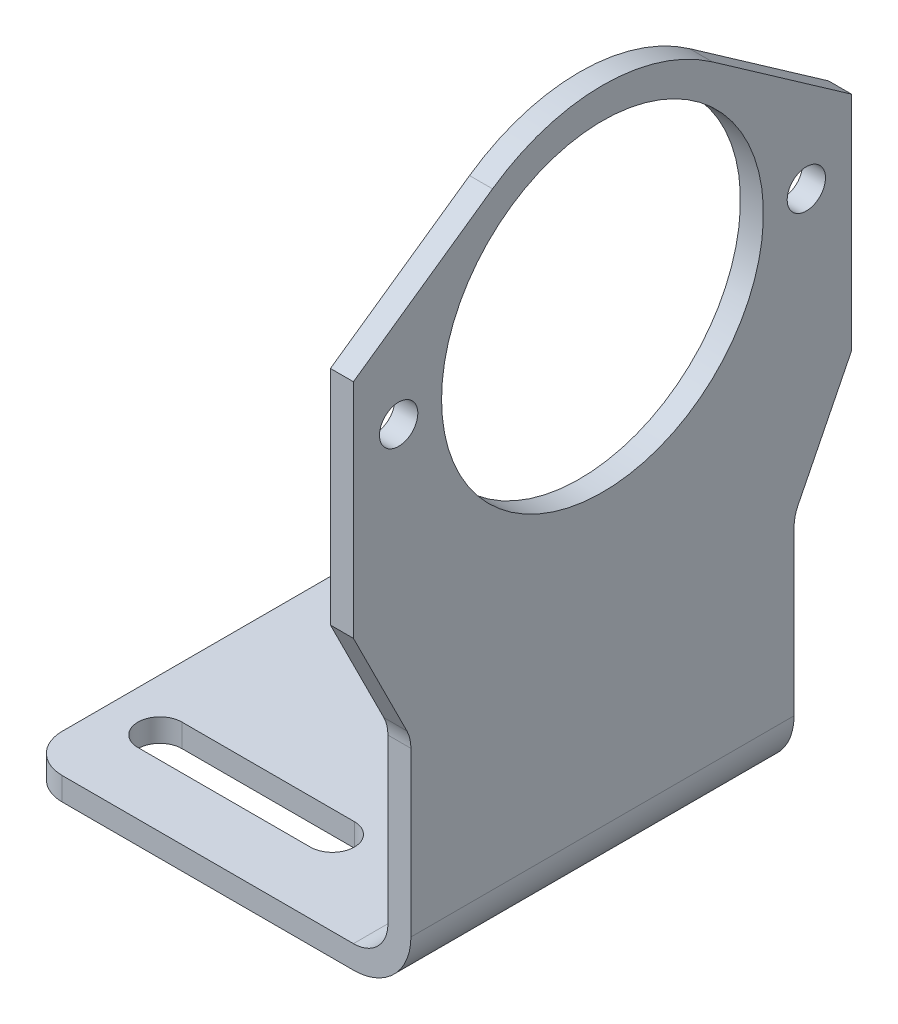
ISO-10303-21;
HEADER;
FILE_DESCRIPTION(('STEP AP214'),'2;1');
FILE_NAME('part.step','',(''),(''),'','','');
FILE_SCHEMA(('AUTOMOTIVE_DESIGN { 1 0 10303 214 1 1 1 1 }'));
ENDSEC;
DATA;
#1=APPLICATION_CONTEXT('core data for automotive mechanical design processes');
#2=APPLICATION_PROTOCOL_DEFINITION('international standard','automotive_design',2000,#1);
#3=PRODUCT_CONTEXT('',#1,'mechanical');
#4=PRODUCT('Part','Part','',(#3));
#5=PRODUCT_RELATED_PRODUCT_CATEGORY('part','',(#4));
#6=PRODUCT_DEFINITION_FORMATION('','',#4);
#7=PRODUCT_DEFINITION_CONTEXT('part definition',#1,'design');
#8=PRODUCT_DEFINITION('design','',#6,#7);
#9=PRODUCT_DEFINITION_SHAPE('','',#8);
#10=(LENGTH_UNIT() NAMED_UNIT(*) SI_UNIT(.MILLI.,.METRE.));
#11=(NAMED_UNIT(*) PLANE_ANGLE_UNIT() SI_UNIT($,.RADIAN.));
#12=(NAMED_UNIT(*) SI_UNIT($,.STERADIAN.) SOLID_ANGLE_UNIT());
#13=UNCERTAINTY_MEASURE_WITH_UNIT(LENGTH_MEASURE(1.E-05),#10,'distance_accuracy_value','');
#14=(GEOMETRIC_REPRESENTATION_CONTEXT(3) GLOBAL_UNCERTAINTY_ASSIGNED_CONTEXT((#13)) GLOBAL_UNIT_ASSIGNED_CONTEXT((#10,
#11,#12)) REPRESENTATION_CONTEXT('',''));
#15=CARTESIAN_POINT('',(0.,0.,0.));
#16=DIRECTION('',(0.,0.,1.));
#17=DIRECTION('',(1.,0.,0.));
#18=AXIS2_PLACEMENT_3D('',#15,#16,#17);
#19=CARTESIAN_POINT('',(-15.,6.,-65.));
#20=DIRECTION('',(0.,0.,-1.));
#21=DIRECTION('',(-1.,0.,0.));
#22=AXIS2_PLACEMENT_3D('',#19,#20,#21);
#23=PLANE('',#22);
#24=DIRECTION('',(0.,1.,0.));
#25=VECTOR('',#24,1.);
#26=CARTESIAN_POINT('',(-6.,0.,-65.));
#27=LINE('',#26,#25);
#28=CARTESIAN_POINT('',(-6.00000000000002,90.,-65.));
#29=VERTEX_POINT('',#28);
#30=CARTESIAN_POINT('',(-6.00000000000001,148.,-65.));
#31=VERTEX_POINT('',#30);
#32=EDGE_CURVE('E429',#29,#31,#27,.T.);
#33=ORIENTED_EDGE('',*,*,#32,.T.);
#34=DIRECTION('',(1.,0.,0.));
#35=VECTOR('',#34,1.);
#36=CARTESIAN_POINT('',(-101.,148.,-65.));
#37=LINE('',#36,#35);
#38=CARTESIAN_POINT('',(0.,148.,-65.));
#39=VERTEX_POINT('',#38);
#40=EDGE_CURVE('E340',#31,#39,#37,.T.);
#41=ORIENTED_EDGE('',*,*,#40,.T.);
#42=DIRECTION('',(0.,1.,0.));
#43=VECTOR('',#42,1.);
#44=CARTESIAN_POINT('',(0.,0.,-65.));
#45=LINE('',#44,#43);
#46=CARTESIAN_POINT('',(0.,89.9999999999999,-65.));
#47=VERTEX_POINT('',#46);
#48=EDGE_CURVE('E420',#47,#39,#45,.T.);
#49=ORIENTED_EDGE('',*,*,#48,.F.);
#50=DIRECTION('',(1.,0.,0.));
#51=VECTOR('',#50,1.);
#52=CARTESIAN_POINT('',(-101.,90.,-65.));
#53=LINE('',#52,#51);
#54=EDGE_CURVE('E345',#29,#47,#53,.T.);
#55=ORIENTED_EDGE('',*,*,#54,.F.);
#56=EDGE_LOOP('',(#33,#41,#49,#55));
#57=FACE_BOUND('',#56,.T.);
#58=ADVANCED_FACE('F60',(#57),#23,.T.);
#59=CARTESIAN_POINT('',(0.,0.,65.));
#60=DIRECTION('',(-1.,0.,0.));
#61=DIRECTION('',(0.,0.,1.));
#62=AXIS2_PLACEMENT_3D('',#59,#60,#61);
#63=PLANE('',#62);
#64=CARTESIAN_POINT('',(0.,132.5,53.2));
#65=DIRECTION('',(-1.,0.,0.));
#66=DIRECTION('',(0.,0.,1.));
#67=AXIS2_PLACEMENT_3D('',#64,#65,#66);
#68=CIRCLE('',#67,5.);
#69=CARTESIAN_POINT('',(0.,132.5,58.2));
#70=VERTEX_POINT('',#69);
#71=EDGE_CURVE('E399',#70,#70,#68,.T.);
#72=ORIENTED_EDGE('',*,*,#71,.T.);
#73=EDGE_LOOP('',(#72));
#74=FACE_BOUND('',#73,.T.);
#75=CARTESIAN_POINT('',(0.,132.5,-53.2));
#76=DIRECTION('',(-1.,0.,0.));
#77=DIRECTION('',(0.,0.,1.));
#78=AXIS2_PLACEMENT_3D('',#75,#76,#77);
#79=CIRCLE('',#78,5.);
#80=CARTESIAN_POINT('',(0.,132.5,-48.2));
#81=VERTEX_POINT('',#80);
#82=EDGE_CURVE('E405',#81,#81,#79,.T.);
#83=ORIENTED_EDGE('',*,*,#82,.T.);
#84=EDGE_LOOP('',(#83));
#85=FACE_BOUND('',#84,.T.);
#86=CARTESIAN_POINT('',(0.,132.5,0.));
#87=DIRECTION('',(-1.,0.,0.));
#88=DIRECTION('',(0.,0.,1.));
#89=AXIS2_PLACEMENT_3D('',#86,#87,#88);
#90=CIRCLE('',#89,42.);
#91=CARTESIAN_POINT('',(0.,132.5,42.));
#92=VERTEX_POINT('',#91);
#93=EDGE_CURVE('E416',#92,#92,#90,.T.);
#94=ORIENTED_EDGE('',*,*,#93,.T.);
#95=EDGE_LOOP('',(#94));
#96=FACE_BOUND('',#95,.T.);
#97=DIRECTION('',(0.,1.,0.));
#98=VECTOR('',#97,1.);
#99=CARTESIAN_POINT('',(0.,0.,50.));
#100=LINE('',#99,#98);
#101=CARTESIAN_POINT('',(0.,15.,50.));
#102=VERTEX_POINT('',#101);
#103=CARTESIAN_POINT('',(0.,57.6393202250021,50.));
#104=VERTEX_POINT('',#103);
#105=EDGE_CURVE('E380',#102,#104,#100,.T.);
#106=ORIENTED_EDGE('',*,*,#105,.F.);
#107=DIRECTION('',(0.,0.,-1.));
#108=VECTOR('',#107,1.);
#109=CARTESIAN_POINT('',(0.,15.,65.));
#110=LINE('',#109,#108);
#111=CARTESIAN_POINT('',(0.,15.,-50.));
#112=VERTEX_POINT('',#111);
#113=EDGE_CURVE('E433',#102,#112,#110,.T.);
#114=ORIENTED_EDGE('',*,*,#113,.T.);
#115=DIRECTION('',(0.,-1.,0.));
#116=VECTOR('',#115,1.);
#117=CARTESIAN_POINT('',(0.,0.,-50.));
#118=LINE('',#117,#116);
#119=CARTESIAN_POINT('',(0.,57.6393202250021,-50.));
#120=VERTEX_POINT('',#119);
#121=EDGE_CURVE('E367',#120,#112,#118,.T.);
#122=ORIENTED_EDGE('',*,*,#121,.F.);
#123=CARTESIAN_POINT('',(0.,57.6393202250021,-60.));
#124=DIRECTION('',(-1.,0.,0.));
#125=DIRECTION('',(0.,0.,1.));
#126=AXIS2_PLACEMENT_3D('',#123,#124,#125);
#127=CIRCLE('',#126,10.);
#128=CARTESIAN_POINT('',(0.,62.1114561800017,-51.0557280900008));
#129=VERTEX_POINT('',#128);
#130=EDGE_CURVE('E69',#120,#129,#127,.T.);
#131=ORIENTED_EDGE('',*,*,#130,.T.);
#132=DIRECTION('',(0.,-0.894427190999916,0.447213595499958));
#133=VECTOR('',#132,1.);
#134=CARTESIAN_POINT('',(0.,90.0000000000002,-65.0000000000001));
#135=LINE('',#134,#133);
#136=EDGE_CURVE('E395',#129,#47,#135,.F.);
#137=ORIENTED_EDGE('',*,*,#136,.T.);
#138=ORIENTED_EDGE('',*,*,#48,.T.);
#139=DIRECTION('',(0.,-0.573958305896006,-0.818884523661906));
#140=VECTOR('',#139,1.);
#141=CARTESIAN_POINT('',(0.,160.34536034807,-47.3864827388777));
#142=LINE('',#141,#140);
#143=CARTESIAN_POINT('',(0.,173.444226183095,-28.6979152948003));
#144=VERTEX_POINT('',#143);
#145=EDGE_CURVE('E396',#144,#39,#142,.T.);
#146=ORIENTED_EDGE('',*,*,#145,.F.);
#147=CARTESIAN_POINT('',(0.,132.5,0.));
#148=DIRECTION('',(1.,0.,0.));
#149=DIRECTION('',(0.,0.,-1.));
#150=AXIS2_PLACEMENT_3D('',#147,#148,#149);
#151=CIRCLE('',#150,50.);
#152=CARTESIAN_POINT('',(0.,173.444226183095,28.6979152948004));
#153=VERTEX_POINT('',#152);
#154=EDGE_CURVE('E489',#153,#144,#151,.F.);
#155=ORIENTED_EDGE('',*,*,#154,.F.);
#156=DIRECTION('',(0.,0.573958305896007,-0.818884523661905));
#157=VECTOR('',#156,1.);
#158=CARTESIAN_POINT('',(0.,99.2446357377619,134.560824940966));
#159=LINE('',#158,#157);
#160=CARTESIAN_POINT('',(0.,148.,65.));
#161=VERTEX_POINT('',#160);
#162=EDGE_CURVE('E360',#161,#153,#159,.T.);
#163=ORIENTED_EDGE('',*,*,#162,.F.);
#164=DIRECTION('',(0.,1.,0.));
#165=VECTOR('',#164,1.);
#166=CARTESIAN_POINT('',(0.,0.,65.));
#167=LINE('',#166,#165);
#168=CARTESIAN_POINT('',(0.,90.,65.));
#169=VERTEX_POINT('',#168);
#170=EDGE_CURVE('E424',#169,#161,#167,.T.);
#171=ORIENTED_EDGE('',*,*,#170,.F.);
#172=DIRECTION('',(0.,0.894427190999916,0.447213595499958));
#173=VECTOR('',#172,1.);
#174=CARTESIAN_POINT('',(0.,60.,50.));
#175=LINE('',#174,#173);
#176=CARTESIAN_POINT('',(0.,62.1114561800017,51.0557280900008));
#177=VERTEX_POINT('',#176);
#178=EDGE_CURVE('E366',#169,#177,#175,.F.);
#179=ORIENTED_EDGE('',*,*,#178,.T.);
#180=CARTESIAN_POINT('',(0.,57.6393202250021,60.));
#181=DIRECTION('',(-1.,0.,0.));
#182=DIRECTION('',(0.,0.,1.));
#183=AXIS2_PLACEMENT_3D('',#180,#181,#182);
#184=CIRCLE('',#183,10.);
#185=EDGE_CURVE('E535',#177,#104,#184,.T.);
#186=ORIENTED_EDGE('',*,*,#185,.T.);
#187=EDGE_LOOP('',(#106,#114,#122,#131,#137,#138,#146,#155,#163,#171,#179,#186));
#188=FACE_BOUND('',#187,.T.);
#189=ADVANCED_FACE('F546',(#74,#85,#96,#188),#63,.F.);
#190=CARTESIAN_POINT('',(-6.,0.,65.));
#191=DIRECTION('',(-1.,0.,0.));
#192=DIRECTION('',(0.,0.,1.));
#193=AXIS2_PLACEMENT_3D('',#190,#191,#192);
#194=PLANE('',#193);
#195=CARTESIAN_POINT('',(-6.,132.5,53.2));
#196=DIRECTION('',(-1.,0.,0.));
#197=DIRECTION('',(0.,0.,1.));
#198=AXIS2_PLACEMENT_3D('',#195,#196,#197);
#199=CIRCLE('',#198,5.);
#200=CARTESIAN_POINT('',(-6.,132.5,58.2));
#201=VERTEX_POINT('',#200);
#202=EDGE_CURVE('E409',#201,#201,#199,.T.);
#203=ORIENTED_EDGE('',*,*,#202,.F.);
#204=EDGE_LOOP('',(#203));
#205=FACE_BOUND('',#204,.T.);
#206=CARTESIAN_POINT('',(-6.,132.5,-53.2));
#207=DIRECTION('',(-1.,0.,0.));
#208=DIRECTION('',(0.,0.,1.));
#209=AXIS2_PLACEMENT_3D('',#206,#207,#208);
#210=CIRCLE('',#209,5.);
#211=CARTESIAN_POINT('',(-6.,132.5,-48.2));
#212=VERTEX_POINT('',#211);
#213=EDGE_CURVE('E400',#212,#212,#210,.T.);
#214=ORIENTED_EDGE('',*,*,#213,.F.);
#215=EDGE_LOOP('',(#214));
#216=FACE_BOUND('',#215,.T.);
#217=CARTESIAN_POINT('',(-6.,132.5,0.));
#218=DIRECTION('',(-1.,0.,0.));
#219=DIRECTION('',(0.,0.,1.));
#220=AXIS2_PLACEMENT_3D('',#217,#218,#219);
#221=CIRCLE('',#220,42.);
#222=CARTESIAN_POINT('',(-6.,132.5,42.));
#223=VERTEX_POINT('',#222);
#224=EDGE_CURVE('E404',#223,#223,#221,.T.);
#225=ORIENTED_EDGE('',*,*,#224,.F.);
#226=EDGE_LOOP('',(#225));
#227=FACE_BOUND('',#226,.T.);
#228=DIRECTION('',(0.,0.,-1.));
#229=VECTOR('',#228,1.);
#230=CARTESIAN_POINT('',(-6.,15.,65.));
#231=LINE('',#230,#229);
#232=CARTESIAN_POINT('',(-6.,15.,50.));
#233=VERTEX_POINT('',#232);
#234=CARTESIAN_POINT('',(-6.,15.,-50.));
#235=VERTEX_POINT('',#234);
#236=EDGE_CURVE('E458',#233,#235,#231,.T.);
#237=ORIENTED_EDGE('',*,*,#236,.F.);
#238=DIRECTION('',(0.,1.,0.));
#239=VECTOR('',#238,1.);
#240=CARTESIAN_POINT('',(-6.,0.,50.));
#241=LINE('',#240,#239);
#242=CARTESIAN_POINT('',(-6.,57.6393202250021,50.));
#243=VERTEX_POINT('',#242);
#244=EDGE_CURVE('E391',#233,#243,#241,.T.);
#245=ORIENTED_EDGE('',*,*,#244,.T.);
#246=CARTESIAN_POINT('',(-6.00000000000001,57.6393202250021,60.));
#247=DIRECTION('',(-1.,0.,0.));
#248=DIRECTION('',(0.,0.,1.));
#249=AXIS2_PLACEMENT_3D('',#246,#247,#248);
#250=CIRCLE('',#249,10.);
#251=CARTESIAN_POINT('',(-6.,62.1114561800017,51.0557280900008));
#252=VERTEX_POINT('',#251);
#253=EDGE_CURVE('E538',#243,#252,#250,.F.);
#254=ORIENTED_EDGE('',*,*,#253,.T.);
#255=DIRECTION('',(0.,0.894427190999916,0.447213595499958));
#256=VECTOR('',#255,1.);
#257=CARTESIAN_POINT('',(-6.,18.,29.));
#258=LINE('',#257,#256);
#259=CARTESIAN_POINT('',(-6.00000000000001,90.,65.));
#260=VERTEX_POINT('',#259);
#261=EDGE_CURVE('E363',#252,#260,#258,.T.);
#262=ORIENTED_EDGE('',*,*,#261,.T.);
#263=DIRECTION('',(0.,1.,0.));
#264=VECTOR('',#263,1.);
#265=CARTESIAN_POINT('',(-6.,0.,65.));
#266=LINE('',#265,#264);
#267=CARTESIAN_POINT('',(-6.,148.,65.));
#268=VERTEX_POINT('',#267);
#269=EDGE_CURVE('E428',#260,#268,#266,.T.);
#270=ORIENTED_EDGE('',*,*,#269,.T.);
#271=DIRECTION('',(0.,0.573958305896007,-0.818884523661905));
#272=VECTOR('',#271,1.);
#273=CARTESIAN_POINT('',(-6.,99.2446357377619,134.560824940966));
#274=LINE('',#273,#272);
#275=CARTESIAN_POINT('',(-6.00000000000001,173.444226183095,28.6979152948004));
#276=VERTEX_POINT('',#275);
#277=EDGE_CURVE('E338',#268,#276,#274,.T.);
#278=ORIENTED_EDGE('',*,*,#277,.T.);
#279=CARTESIAN_POINT('',(-6.00000000000001,132.5,0.));
#280=DIRECTION('',(-1.,0.,0.));
#281=DIRECTION('',(0.,0.,1.));
#282=AXIS2_PLACEMENT_3D('',#279,#280,#281);
#283=CIRCLE('',#282,50.);
#284=CARTESIAN_POINT('',(-6.,173.444226183095,-28.6979152948003));
#285=VERTEX_POINT('',#284);
#286=EDGE_CURVE('E485',#276,#285,#283,.T.);
#287=ORIENTED_EDGE('',*,*,#286,.T.);
#288=DIRECTION('',(0.,-0.573958305896006,-0.818884523661906));
#289=VECTOR('',#288,1.);
#290=CARTESIAN_POINT('',(-6.,160.34536034807,-47.3864827388777));
#291=LINE('',#290,#289);
#292=EDGE_CURVE('E481',#285,#31,#291,.T.);
#293=ORIENTED_EDGE('',*,*,#292,.T.);
#294=ORIENTED_EDGE('',*,*,#32,.F.);
#295=DIRECTION('',(0.,-0.894427190999916,0.447213595499958));
#296=VECTOR('',#295,1.);
#297=CARTESIAN_POINT('',(-6.,-34.,-3.));
#298=LINE('',#297,#296);
#299=CARTESIAN_POINT('',(-6.,62.1114561800017,-51.0557280900009));
#300=VERTEX_POINT('',#299);
#301=EDGE_CURVE('E477',#29,#300,#298,.T.);
#302=ORIENTED_EDGE('',*,*,#301,.T.);
#303=CARTESIAN_POINT('',(-6.00000000000001,57.6393202250021,-60.));
#304=DIRECTION('',(-1.,0.,0.));
#305=DIRECTION('',(0.,0.,1.));
#306=AXIS2_PLACEMENT_3D('',#303,#304,#305);
#307=CIRCLE('',#306,10.);
#308=CARTESIAN_POINT('',(-6.,57.6393202250021,-50.));
#309=VERTEX_POINT('',#308);
#310=EDGE_CURVE('E14',#300,#309,#307,.F.);
#311=ORIENTED_EDGE('',*,*,#310,.T.);
#312=DIRECTION('',(0.,-1.,0.));
#313=VECTOR('',#312,1.);
#314=CARTESIAN_POINT('',(-6.,0.,-50.));
#315=LINE('',#314,#313);
#316=EDGE_CURVE('E377',#309,#235,#315,.T.);
#317=ORIENTED_EDGE('',*,*,#316,.T.);
#318=EDGE_LOOP('',(#237,#245,#254,#262,#270,#278,#287,#293,#294,#302,#311,#317));
#319=FACE_BOUND('',#318,.T.);
#320=ADVANCED_FACE('F559',(#205,#216,#227,#319),#194,.T.);
#321=CARTESIAN_POINT('',(-15.,15.,65.));
#322=DIRECTION('',(0.,0.,-1.));
#323=DIRECTION('',(-1.,0.,0.));
#324=AXIS2_PLACEMENT_3D('',#321,#322,#323);
#325=CYLINDRICAL_SURFACE('',#324,9.);
#326=DIRECTION('',(0.,0.,-1.));
#327=VECTOR('',#326,1.);
#328=CARTESIAN_POINT('',(-15.,6.,65.));
#329=LINE('',#328,#327);
#330=CARTESIAN_POINT('',(-15.,6.,50.));
#331=VERTEX_POINT('',#330);
#332=CARTESIAN_POINT('',(-15.,6.,-50.));
#333=VERTEX_POINT('',#332);
#334=EDGE_CURVE('E454',#331,#333,#329,.T.);
#335=ORIENTED_EDGE('',*,*,#334,.F.);
#336=CARTESIAN_POINT('',(-15.,15.,50.));
#337=DIRECTION('',(0.,0.,1.));
#338=DIRECTION('',(1.,0.,0.));
#339=AXIS2_PLACEMENT_3D('',#336,#337,#338);
#340=CIRCLE('',#339,9.);
#341=EDGE_CURVE('E387',#331,#233,#340,.T.);
#342=ORIENTED_EDGE('',*,*,#341,.T.);
#343=ORIENTED_EDGE('',*,*,#236,.T.);
#344=CARTESIAN_POINT('',(-15.,15.,-50.));
#345=DIRECTION('',(0.,0.,-1.));
#346=DIRECTION('',(-1.,0.,0.));
#347=AXIS2_PLACEMENT_3D('',#344,#345,#346);
#348=CIRCLE('',#347,9.);
#349=EDGE_CURVE('E373',#235,#333,#348,.T.);
#350=ORIENTED_EDGE('',*,*,#349,.T.);
#351=EDGE_LOOP('',(#335,#342,#343,#350));
#352=FACE_BOUND('',#351,.T.);
#353=ADVANCED_FACE('F566',(#352),#325,.F.);
#354=CARTESIAN_POINT('',(-101.,6.,65.));
#355=DIRECTION('',(0.,1.,0.));
#356=DIRECTION('',(0.,0.,1.));
#357=AXIS2_PLACEMENT_3D('',#354,#355,#356);
#358=PLANE('',#357);
#359=CARTESIAN_POINT('',(-42.45,6.,-27.95));
#360=DIRECTION('',(0.,1.,0.));
#361=DIRECTION('',(0.,0.,1.));
#362=AXIS2_PLACEMENT_3D('',#359,#360,#361);
#363=CIRCLE('',#362,5.75000000000001);
#364=CARTESIAN_POINT('',(-42.45,6.,-22.2));
#365=VERTEX_POINT('',#364);
#366=CARTESIAN_POINT('',(-42.45,6.,-33.7));
#367=VERTEX_POINT('',#366);
#368=EDGE_CURVE('E241',#365,#367,#363,.T.);
#369=ORIENTED_EDGE('',*,*,#368,.F.);
#370=DIRECTION('',(1.,0.,0.));
#371=VECTOR('',#370,1.);
#372=CARTESIAN_POINT('',(-42.45,6.,-22.2));
#373=LINE('',#372,#371);
#374=CARTESIAN_POINT('',(-87.45,6.,-22.2));
#375=VERTEX_POINT('',#374);
#376=EDGE_CURVE('E262',#375,#365,#373,.T.);
#377=ORIENTED_EDGE('',*,*,#376,.F.);
#378=CARTESIAN_POINT('',(-87.45,6.,-27.95));
#379=DIRECTION('',(0.,1.,0.));
#380=DIRECTION('',(0.,0.,1.));
#381=AXIS2_PLACEMENT_3D('',#378,#379,#380);
#382=CIRCLE('',#381,5.75);
#383=CARTESIAN_POINT('',(-87.45,6.,-33.7));
#384=VERTEX_POINT('',#383);
#385=EDGE_CURVE('E268',#384,#375,#382,.T.);
#386=ORIENTED_EDGE('',*,*,#385,.F.);
#387=DIRECTION('',(-1.,0.,0.));
#388=VECTOR('',#387,1.);
#389=CARTESIAN_POINT('',(-42.45,6.,-33.7));
#390=LINE('',#389,#388);
#391=EDGE_CURVE('E277',#367,#384,#390,.T.);
#392=ORIENTED_EDGE('',*,*,#391,.F.);
#393=EDGE_LOOP('',(#369,#377,#386,#392));
#394=FACE_BOUND('',#393,.T.);
#395=CARTESIAN_POINT('',(-42.45,6.,28.05));
#396=DIRECTION('',(0.,1.,0.));
#397=DIRECTION('',(0.,0.,1.));
#398=AXIS2_PLACEMENT_3D('',#395,#396,#397);
#399=CIRCLE('',#398,5.75);
#400=CARTESIAN_POINT('',(-42.45,6.,33.8));
#401=VERTEX_POINT('',#400);
#402=CARTESIAN_POINT('',(-42.45,6.,22.3));
#403=VERTEX_POINT('',#402);
#404=EDGE_CURVE('E278',#401,#403,#399,.T.);
#405=ORIENTED_EDGE('',*,*,#404,.F.);
#406=DIRECTION('',(1.,0.,0.));
#407=VECTOR('',#406,1.);
#408=CARTESIAN_POINT('',(-42.45,6.,33.8));
#409=LINE('',#408,#407);
#410=CARTESIAN_POINT('',(-87.45,6.,33.8));
#411=VERTEX_POINT('',#410);
#412=EDGE_CURVE('E306',#411,#401,#409,.T.);
#413=ORIENTED_EDGE('',*,*,#412,.F.);
#414=CARTESIAN_POINT('',(-87.45,6.,28.05));
#415=DIRECTION('',(0.,1.,0.));
#416=DIRECTION('',(0.,0.,1.));
#417=AXIS2_PLACEMENT_3D('',#414,#415,#416);
#418=CIRCLE('',#417,5.75);
#419=CARTESIAN_POINT('',(-87.45,6.,22.3));
#420=VERTEX_POINT('',#419);
#421=EDGE_CURVE('E310',#420,#411,#418,.T.);
#422=ORIENTED_EDGE('',*,*,#421,.F.);
#423=DIRECTION('',(-1.,0.,0.));
#424=VECTOR('',#423,1.);
#425=CARTESIAN_POINT('',(-42.45,6.,22.3));
#426=LINE('',#425,#424);
#427=EDGE_CURVE('E315',#403,#420,#426,.T.);
#428=ORIENTED_EDGE('',*,*,#427,.F.);
#429=EDGE_LOOP('',(#405,#413,#422,#428));
#430=FACE_BOUND('',#429,.T.);
#431=DIRECTION('',(0.,0.,-1.));
#432=VECTOR('',#431,1.);
#433=CARTESIAN_POINT('',(-101.,6.,65.));
#434=LINE('',#433,#432);
#435=CARTESIAN_POINT('',(-101.,6.,40.));
#436=VERTEX_POINT('',#435);
#437=CARTESIAN_POINT('',(-101.,6.,-40.));
#438=VERTEX_POINT('',#437);
#439=EDGE_CURVE('E451',#436,#438,#434,.T.);
#440=ORIENTED_EDGE('',*,*,#439,.F.);
#441=CARTESIAN_POINT('',(-91.,6.,40.));
#442=DIRECTION('',(0.,1.,0.));
#443=DIRECTION('',(0.,0.,1.));
#444=AXIS2_PLACEMENT_3D('',#441,#442,#443);
#445=CIRCLE('',#444,10.);
#446=CARTESIAN_POINT('',(-91.,6.,50.));
#447=VERTEX_POINT('',#446);
#448=EDGE_CURVE('E532',#436,#447,#445,.T.);
#449=ORIENTED_EDGE('',*,*,#448,.T.);
#450=DIRECTION('',(1.,0.,0.));
#451=VECTOR('',#450,1.);
#452=CARTESIAN_POINT('',(-101.,6.,50.));
#453=LINE('',#452,#451);
#454=EDGE_CURVE('E384',#447,#331,#453,.T.);
#455=ORIENTED_EDGE('',*,*,#454,.T.);
#456=ORIENTED_EDGE('',*,*,#334,.T.);
#457=DIRECTION('',(-1.,0.,0.));
#458=VECTOR('',#457,1.);
#459=CARTESIAN_POINT('',(-101.,6.,-50.));
#460=LINE('',#459,#458);
#461=CARTESIAN_POINT('',(-91.,6.,-50.));
#462=VERTEX_POINT('',#461);
#463=EDGE_CURVE('E370',#333,#462,#460,.T.);
#464=ORIENTED_EDGE('',*,*,#463,.T.);
#465=CARTESIAN_POINT('',(-91.,6.,-40.));
#466=DIRECTION('',(0.,1.,0.));
#467=DIRECTION('',(0.,0.,1.));
#468=AXIS2_PLACEMENT_3D('',#465,#466,#467);
#469=CIRCLE('',#468,10.);
#470=EDGE_CURVE('E76',#462,#438,#469,.T.);
#471=ORIENTED_EDGE('',*,*,#470,.T.);
#472=EDGE_LOOP('',(#440,#449,#455,#456,#464,#471));
#473=FACE_BOUND('',#472,.T.);
#474=ADVANCED_FACE('F618',(#394,#430,#473),#358,.T.);
#475=CARTESIAN_POINT('',(-101.,0.,65.));
#476=DIRECTION('',(-1.,0.,0.));
#477=DIRECTION('',(0.,0.,1.));
#478=AXIS2_PLACEMENT_3D('',#475,#476,#477);
#479=PLANE('',#478);
#480=DIRECTION('',(0.,0.,-1.));
#481=VECTOR('',#480,1.);
#482=CARTESIAN_POINT('',(-101.,0.,65.));
#483=LINE('',#482,#481);
#484=CARTESIAN_POINT('',(-101.,0.,40.));
#485=VERTEX_POINT('',#484);
#486=CARTESIAN_POINT('',(-101.,0.,-40.));
#487=VERTEX_POINT('',#486);
#488=EDGE_CURVE('E447',#485,#487,#483,.T.);
#489=ORIENTED_EDGE('',*,*,#488,.F.);
#490=DIRECTION('',(0.,-1.,0.));
#491=VECTOR('',#490,1.);
#492=CARTESIAN_POINT('',(-101.,0.,40.));
#493=LINE('',#492,#491);
#494=EDGE_CURVE('E83',#485,#436,#493,.F.);
#495=ORIENTED_EDGE('',*,*,#494,.T.);
#496=ORIENTED_EDGE('',*,*,#439,.T.);
#497=DIRECTION('',(0.,1.,0.));
#498=VECTOR('',#497,1.);
#499=CARTESIAN_POINT('',(-101.,0.,-40.));
#500=LINE('',#499,#498);
#501=EDGE_CURVE('E525',#438,#487,#500,.F.);
#502=ORIENTED_EDGE('',*,*,#501,.T.);
#503=EDGE_LOOP('',(#489,#495,#496,#502));
#504=FACE_BOUND('',#503,.T.);
#505=ADVANCED_FACE('F632',(#504),#479,.T.);
#506=CARTESIAN_POINT('',(-101.,0.,65.));
#507=DIRECTION('',(0.,1.,0.));
#508=DIRECTION('',(0.,0.,1.));
#509=AXIS2_PLACEMENT_3D('',#506,#507,#508);
#510=PLANE('',#509);
#511=DIRECTION('',(1.,0.,0.));
#512=VECTOR('',#511,1.);
#513=CARTESIAN_POINT('',(-42.45,0.,-22.2));
#514=LINE('',#513,#512);
#515=CARTESIAN_POINT('',(-87.45,0.,-22.2));
#516=VERTEX_POINT('',#515);
#517=CARTESIAN_POINT('',(-42.45,0.,-22.2));
#518=VERTEX_POINT('',#517);
#519=EDGE_CURVE('E247',#516,#518,#514,.T.);
#520=ORIENTED_EDGE('',*,*,#519,.T.);
#521=CARTESIAN_POINT('',(-42.45,0.,-27.95));
#522=DIRECTION('',(0.,1.,0.));
#523=DIRECTION('',(0.,0.,1.));
#524=AXIS2_PLACEMENT_3D('',#521,#522,#523);
#525=CIRCLE('',#524,5.75000000000001);
#526=CARTESIAN_POINT('',(-42.45,0.,-33.7));
#527=VERTEX_POINT('',#526);
#528=EDGE_CURVE('E238',#518,#527,#525,.T.);
#529=ORIENTED_EDGE('',*,*,#528,.T.);
#530=DIRECTION('',(-1.,0.,0.));
#531=VECTOR('',#530,1.);
#532=CARTESIAN_POINT('',(-42.45,0.,-33.7));
#533=LINE('',#532,#531);
#534=CARTESIAN_POINT('',(-87.45,0.,-33.7));
#535=VERTEX_POINT('',#534);
#536=EDGE_CURVE('E251',#527,#535,#533,.T.);
#537=ORIENTED_EDGE('',*,*,#536,.T.);
#538=CARTESIAN_POINT('',(-87.45,0.,-27.95));
#539=DIRECTION('',(0.,1.,0.));
#540=DIRECTION('',(0.,0.,1.));
#541=AXIS2_PLACEMENT_3D('',#538,#539,#540);
#542=CIRCLE('',#541,5.75);
#543=EDGE_CURVE('E256',#535,#516,#542,.T.);
#544=ORIENTED_EDGE('',*,*,#543,.T.);
#545=EDGE_LOOP('',(#520,#529,#537,#544));
#546=FACE_BOUND('',#545,.T.);
#547=DIRECTION('',(1.,0.,0.));
#548=VECTOR('',#547,1.);
#549=CARTESIAN_POINT('',(-42.45,0.,33.8));
#550=LINE('',#549,#548);
#551=CARTESIAN_POINT('',(-87.45,0.,33.8));
#552=VERTEX_POINT('',#551);
#553=CARTESIAN_POINT('',(-42.45,0.,33.8));
#554=VERTEX_POINT('',#553);
#555=EDGE_CURVE('E296',#552,#554,#550,.T.);
#556=ORIENTED_EDGE('',*,*,#555,.T.);
#557=CARTESIAN_POINT('',(-42.45,0.,28.05));
#558=DIRECTION('',(0.,1.,0.));
#559=DIRECTION('',(0.,0.,1.));
#560=AXIS2_PLACEMENT_3D('',#557,#558,#559);
#561=CIRCLE('',#560,5.75);
#562=CARTESIAN_POINT('',(-42.45,0.,22.3));
#563=VERTEX_POINT('',#562);
#564=EDGE_CURVE('E311',#554,#563,#561,.T.);
#565=ORIENTED_EDGE('',*,*,#564,.T.);
#566=DIRECTION('',(-1.,0.,0.));
#567=VECTOR('',#566,1.);
#568=CARTESIAN_POINT('',(-42.45,0.,22.3));
#569=LINE('',#568,#567);
#570=CARTESIAN_POINT('',(-87.45,0.,22.3));
#571=VERTEX_POINT('',#570);
#572=EDGE_CURVE('E328',#563,#571,#569,.T.);
#573=ORIENTED_EDGE('',*,*,#572,.T.);
#574=CARTESIAN_POINT('',(-87.45,0.,28.05));
#575=DIRECTION('',(0.,1.,0.));
#576=DIRECTION('',(0.,0.,1.));
#577=AXIS2_PLACEMENT_3D('',#574,#575,#576);
#578=CIRCLE('',#577,5.75);
#579=EDGE_CURVE('E324',#571,#552,#578,.T.);
#580=ORIENTED_EDGE('',*,*,#579,.T.);
#581=EDGE_LOOP('',(#556,#565,#573,#580));
#582=FACE_BOUND('',#581,.T.);
#583=DIRECTION('',(1.,0.,0.));
#584=VECTOR('',#583,1.);
#585=CARTESIAN_POINT('',(-101.,0.,50.));
#586=LINE('',#585,#584);
#587=CARTESIAN_POINT('',(-91.,0.,50.));
#588=VERTEX_POINT('',#587);
#589=CARTESIAN_POINT('',(-15.,0.,50.));
#590=VERTEX_POINT('',#589);
#591=EDGE_CURVE('E335',#588,#590,#586,.T.);
#592=ORIENTED_EDGE('',*,*,#591,.F.);
#593=CARTESIAN_POINT('',(-91.,0.,40.));
#594=DIRECTION('',(0.,1.,0.));
#595=DIRECTION('',(0.,0.,1.));
#596=AXIS2_PLACEMENT_3D('',#593,#594,#595);
#597=CIRCLE('',#596,10.);
#598=EDGE_CURVE('E522',#588,#485,#597,.F.);
#599=ORIENTED_EDGE('',*,*,#598,.T.);
#600=ORIENTED_EDGE('',*,*,#488,.T.);
#601=CARTESIAN_POINT('',(-91.,0.,-40.));
#602=DIRECTION('',(0.,1.,0.));
#603=DIRECTION('',(0.,0.,1.));
#604=AXIS2_PLACEMENT_3D('',#601,#602,#603);
#605=CIRCLE('',#604,10.);
#606=CARTESIAN_POINT('',(-91.,0.,-50.));
#607=VERTEX_POINT('',#606);
#608=EDGE_CURVE('E519',#487,#607,#605,.F.);
#609=ORIENTED_EDGE('',*,*,#608,.T.);
#610=DIRECTION('',(1.,0.,0.));
#611=VECTOR('',#610,1.);
#612=CARTESIAN_POINT('',(-101.,0.,-50.));
#613=LINE('',#612,#611);
#614=CARTESIAN_POINT('',(-15.,0.,-50.));
#615=VERTEX_POINT('',#614);
#616=EDGE_CURVE('E286',#607,#615,#613,.T.);
#617=ORIENTED_EDGE('',*,*,#616,.T.);
#618=DIRECTION('',(0.,0.,-1.));
#619=VECTOR('',#618,1.);
#620=CARTESIAN_POINT('',(-15.,0.,65.));
#621=LINE('',#620,#619);
#622=EDGE_CURVE('E443',#590,#615,#621,.T.);
#623=ORIENTED_EDGE('',*,*,#622,.F.);
#624=EDGE_LOOP('',(#592,#599,#600,#609,#617,#623));
#625=FACE_BOUND('',#624,.T.);
#626=ADVANCED_FACE('F258',(#546,#582,#625),#510,.F.);
#627=CARTESIAN_POINT('',(-15.,15.,65.));
#628=DIRECTION('',(0.,0.,-1.));
#629=DIRECTION('',(-1.,0.,0.));
#630=AXIS2_PLACEMENT_3D('',#627,#628,#629);
#631=CYLINDRICAL_SURFACE('',#630,15.);
#632=CARTESIAN_POINT('',(-15.,15.,50.));
#633=DIRECTION('',(0.,0.,1.));
#634=DIRECTION('',(1.,0.,0.));
#635=AXIS2_PLACEMENT_3D('',#632,#633,#634);
#636=CIRCLE('',#635,15.);
#637=EDGE_CURVE('E474',#590,#102,#636,.T.);
#638=ORIENTED_EDGE('',*,*,#637,.F.);
#639=ORIENTED_EDGE('',*,*,#622,.T.);
#640=CARTESIAN_POINT('',(-15.,15.,-50.));
#641=DIRECTION('',(0.,0.,-1.));
#642=DIRECTION('',(-1.,0.,0.));
#643=AXIS2_PLACEMENT_3D('',#640,#641,#642);
#644=CIRCLE('',#643,15.);
#645=EDGE_CURVE('E470',#112,#615,#644,.T.);
#646=ORIENTED_EDGE('',*,*,#645,.F.);
#647=ORIENTED_EDGE('',*,*,#113,.F.);
#648=EDGE_LOOP('',(#638,#639,#646,#647));
#649=FACE_BOUND('',#648,.T.);
#650=ADVANCED_FACE('F627',(#649),#631,.T.);
#651=CARTESIAN_POINT('',(-15.,15.,65.));
#652=DIRECTION('',(0.,0.,1.));
#653=DIRECTION('',(1.,0.,0.));
#654=AXIS2_PLACEMENT_3D('',#651,#652,#653);
#655=PLANE('',#654);
#656=ORIENTED_EDGE('',*,*,#269,.F.);
#657=DIRECTION('',(1.,0.,0.));
#658=VECTOR('',#657,1.);
#659=CARTESIAN_POINT('',(-15.,90.,65.));
#660=LINE('',#659,#658);
#661=EDGE_CURVE('E466',#260,#169,#660,.T.);
#662=ORIENTED_EDGE('',*,*,#661,.T.);
#663=ORIENTED_EDGE('',*,*,#170,.T.);
#664=DIRECTION('',(-1.,0.,0.));
#665=VECTOR('',#664,1.);
#666=CARTESIAN_POINT('',(-15.,148.,65.));
#667=LINE('',#666,#665);
#668=EDGE_CURVE('E462',#161,#268,#667,.T.);
#669=ORIENTED_EDGE('',*,*,#668,.T.);
#670=EDGE_LOOP('',(#656,#662,#663,#669));
#671=FACE_BOUND('',#670,.T.);
#672=ADVANCED_FACE('F583',(#671),#655,.T.);
#673=CARTESIAN_POINT('',(0.,132.5,0.));
#674=DIRECTION('',(-1.,0.,0.));
#675=DIRECTION('',(0.,0.,1.));
#676=AXIS2_PLACEMENT_3D('',#673,#674,#675);
#677=CYLINDRICAL_SURFACE('',#676,42.);
#678=ORIENTED_EDGE('',*,*,#93,.F.);
#679=EDGE_LOOP('',(#678));
#680=FACE_BOUND('',#679,.T.);
#681=ORIENTED_EDGE('',*,*,#224,.T.);
#682=EDGE_LOOP('',(#681));
#683=FACE_BOUND('',#682,.T.);
#684=ADVANCED_FACE('F654',(#680,#683),#677,.F.);
#685=CARTESIAN_POINT('',(0.,132.5,-53.2));
#686=DIRECTION('',(-1.,0.,0.));
#687=DIRECTION('',(0.,0.,1.));
#688=AXIS2_PLACEMENT_3D('',#685,#686,#687);
#689=CYLINDRICAL_SURFACE('',#688,5.);
#690=ORIENTED_EDGE('',*,*,#82,.F.);
#691=EDGE_LOOP('',(#690));
#692=FACE_BOUND('',#691,.T.);
#693=ORIENTED_EDGE('',*,*,#213,.T.);
#694=EDGE_LOOP('',(#693));
#695=FACE_BOUND('',#694,.T.);
#696=ADVANCED_FACE('F656',(#692,#695),#689,.F.);
#697=CARTESIAN_POINT('',(0.,132.5,53.2));
#698=DIRECTION('',(-1.,0.,0.));
#699=DIRECTION('',(0.,0.,1.));
#700=AXIS2_PLACEMENT_3D('',#697,#698,#699);
#701=CYLINDRICAL_SURFACE('',#700,5.);
#702=ORIENTED_EDGE('',*,*,#71,.F.);
#703=EDGE_LOOP('',(#702));
#704=FACE_BOUND('',#703,.T.);
#705=ORIENTED_EDGE('',*,*,#202,.T.);
#706=EDGE_LOOP('',(#705));
#707=FACE_BOUND('',#706,.T.);
#708=ADVANCED_FACE('F662',(#704,#707),#701,.F.);
#709=CARTESIAN_POINT('',(-101.,148.,-65.));
#710=DIRECTION('',(0.,0.818884523661906,-0.573958305896006));
#711=DIRECTION('',(0.,0.573958305896006,0.818884523661906));
#712=AXIS2_PLACEMENT_3D('',#709,#710,#711);
#713=PLANE('',#712);
#714=ORIENTED_EDGE('',*,*,#145,.T.);
#715=ORIENTED_EDGE('',*,*,#40,.F.);
#716=ORIENTED_EDGE('',*,*,#292,.F.);
#717=DIRECTION('',(1.,0.,0.));
#718=VECTOR('',#717,1.);
#719=CARTESIAN_POINT('',(-101.,173.444226183095,-28.6979152948003));
#720=LINE('',#719,#718);
#721=EDGE_CURVE('E344',#285,#144,#720,.T.);
#722=ORIENTED_EDGE('',*,*,#721,.T.);
#723=EDGE_LOOP('',(#714,#715,#716,#722));
#724=FACE_BOUND('',#723,.T.);
#725=ADVANCED_FACE('F592',(#724),#713,.T.);
#726=CARTESIAN_POINT('',(-101.,148.,65.));
#727=DIRECTION('',(0.,0.818884523661905,0.573958305896007));
#728=DIRECTION('',(0.,-0.573958305896007,0.818884523661905));
#729=AXIS2_PLACEMENT_3D('',#726,#727,#728);
#730=PLANE('',#729);
#731=ORIENTED_EDGE('',*,*,#162,.T.);
#732=DIRECTION('',(1.,0.,0.));
#733=VECTOR('',#732,1.);
#734=CARTESIAN_POINT('',(-101.,173.444226183095,28.6979152948004));
#735=LINE('',#734,#733);
#736=EDGE_CURVE('E339',#276,#153,#735,.T.);
#737=ORIENTED_EDGE('',*,*,#736,.F.);
#738=ORIENTED_EDGE('',*,*,#277,.F.);
#739=ORIENTED_EDGE('',*,*,#668,.F.);
#740=EDGE_LOOP('',(#731,#737,#738,#739));
#741=FACE_BOUND('',#740,.T.);
#742=ADVANCED_FACE('F586',(#741),#730,.T.);
#743=CARTESIAN_POINT('',(-101.,132.5,0.));
#744=DIRECTION('',(1.,0.,0.));
#745=DIRECTION('',(0.,0.,-1.));
#746=AXIS2_PLACEMENT_3D('',#743,#744,#745);
#747=CYLINDRICAL_SURFACE('',#746,50.);
#748=ORIENTED_EDGE('',*,*,#154,.T.);
#749=ORIENTED_EDGE('',*,*,#721,.F.);
#750=ORIENTED_EDGE('',*,*,#286,.F.);
#751=ORIENTED_EDGE('',*,*,#736,.T.);
#752=EDGE_LOOP('',(#748,#749,#750,#751));
#753=FACE_BOUND('',#752,.T.);
#754=ADVANCED_FACE('F588',(#753),#747,.T.);
#755=CARTESIAN_POINT('',(-101.,60.,50.));
#756=DIRECTION('',(0.,-0.447213595499958,0.894427190999916));
#757=DIRECTION('',(0.,-0.894427190999916,-0.447213595499958));
#758=AXIS2_PLACEMENT_3D('',#755,#756,#757);
#759=PLANE('',#758);
#760=ORIENTED_EDGE('',*,*,#261,.F.);
#761=DIRECTION('',(1.,0.,0.));
#762=VECTOR('',#761,1.);
#763=CARTESIAN_POINT('',(0.,62.1114561800017,51.0557280900008));
#764=LINE('',#763,#762);
#765=EDGE_CURVE('E497',#252,#177,#764,.T.);
#766=ORIENTED_EDGE('',*,*,#765,.T.);
#767=ORIENTED_EDGE('',*,*,#178,.F.);
#768=ORIENTED_EDGE('',*,*,#661,.F.);
#769=EDGE_LOOP('',(#760,#766,#767,#768));
#770=FACE_BOUND('',#769,.T.);
#771=ADVANCED_FACE('F576',(#770),#759,.T.);
#772=CARTESIAN_POINT('',(-101.,0.,50.));
#773=DIRECTION('',(0.,0.,1.));
#774=DIRECTION('',(1.,0.,0.));
#775=AXIS2_PLACEMENT_3D('',#772,#773,#774);
#776=PLANE('',#775);
#777=ORIENTED_EDGE('',*,*,#105,.T.);
#778=DIRECTION('',(1.,0.,0.));
#779=VECTOR('',#778,1.);
#780=CARTESIAN_POINT('',(-6.00000000000002,57.6393202250021,50.));
#781=LINE('',#780,#779);
#782=EDGE_CURVE('E505',#104,#243,#781,.F.);
#783=ORIENTED_EDGE('',*,*,#782,.T.);
#784=ORIENTED_EDGE('',*,*,#244,.F.);
#785=ORIENTED_EDGE('',*,*,#341,.F.);
#786=ORIENTED_EDGE('',*,*,#454,.F.);
#787=DIRECTION('',(0.,-1.,0.));
#788=VECTOR('',#787,1.);
#789=CARTESIAN_POINT('',(-91.,0.,50.));
#790=LINE('',#789,#788);
#791=EDGE_CURVE('E501',#447,#588,#790,.T.);
#792=ORIENTED_EDGE('',*,*,#791,.T.);
#793=ORIENTED_EDGE('',*,*,#591,.T.);
#794=ORIENTED_EDGE('',*,*,#637,.T.);
#795=EDGE_LOOP('',(#777,#783,#784,#785,#786,#792,#793,#794));
#796=FACE_BOUND('',#795,.T.);
#797=ADVANCED_FACE('F619',(#796),#776,.T.);
#798=CARTESIAN_POINT('',(-101.,60.,-50.));
#799=DIRECTION('',(0.,-0.447213595499958,-0.894427190999916));
#800=DIRECTION('',(0.,0.894427190999916,-0.447213595499958));
#801=AXIS2_PLACEMENT_3D('',#798,#799,#800);
#802=PLANE('',#801);
#803=ORIENTED_EDGE('',*,*,#136,.F.);
#804=DIRECTION('',(1.,0.,0.));
#805=VECTOR('',#804,1.);
#806=CARTESIAN_POINT('',(-6.00000000000001,62.1114561800017,-51.0557280900008));
#807=LINE('',#806,#805);
#808=EDGE_CURVE('E516',#129,#300,#807,.F.);
#809=ORIENTED_EDGE('',*,*,#808,.T.);
#810=ORIENTED_EDGE('',*,*,#301,.F.);
#811=ORIENTED_EDGE('',*,*,#54,.T.);
#812=EDGE_LOOP('',(#803,#809,#810,#811));
#813=FACE_BOUND('',#812,.T.);
#814=ADVANCED_FACE('F551',(#813),#802,.T.);
#815=CARTESIAN_POINT('',(-101.,0.,-50.));
#816=DIRECTION('',(0.,0.,-1.));
#817=DIRECTION('',(-1.,0.,0.));
#818=AXIS2_PLACEMENT_3D('',#815,#816,#817);
#819=PLANE('',#818);
#820=ORIENTED_EDGE('',*,*,#316,.F.);
#821=DIRECTION('',(1.,0.,0.));
#822=VECTOR('',#821,1.);
#823=CARTESIAN_POINT('',(0.,57.6393202250021,-50.));
#824=LINE('',#823,#822);
#825=EDGE_CURVE('E512',#309,#120,#824,.T.);
#826=ORIENTED_EDGE('',*,*,#825,.T.);
#827=ORIENTED_EDGE('',*,*,#121,.T.);
#828=ORIENTED_EDGE('',*,*,#645,.T.);
#829=ORIENTED_EDGE('',*,*,#616,.F.);
#830=DIRECTION('',(0.,1.,0.));
#831=VECTOR('',#830,1.);
#832=CARTESIAN_POINT('',(-91.,0.,-50.));
#833=LINE('',#832,#831);
#834=EDGE_CURVE('E508',#607,#462,#833,.T.);
#835=ORIENTED_EDGE('',*,*,#834,.T.);
#836=ORIENTED_EDGE('',*,*,#463,.F.);
#837=ORIENTED_EDGE('',*,*,#349,.F.);
#838=EDGE_LOOP('',(#820,#826,#827,#828,#829,#835,#836,#837));
#839=FACE_BOUND('',#838,.T.);
#840=ADVANCED_FACE('F563',(#839),#819,.T.);
#841=CARTESIAN_POINT('',(-42.45,0.,28.05));
#842=DIRECTION('',(0.,1.,0.));
#843=DIRECTION('',(0.,0.,1.));
#844=AXIS2_PLACEMENT_3D('',#841,#842,#843);
#845=CYLINDRICAL_SURFACE('',#844,5.75);
#846=ORIENTED_EDGE('',*,*,#404,.T.);
#847=DIRECTION('',(0.,1.,0.));
#848=VECTOR('',#847,1.);
#849=CARTESIAN_POINT('',(-42.45,0.,22.3));
#850=LINE('',#849,#848);
#851=EDGE_CURVE('E292',#563,#403,#850,.T.);
#852=ORIENTED_EDGE('',*,*,#851,.F.);
#853=ORIENTED_EDGE('',*,*,#564,.F.);
#854=DIRECTION('',(0.,1.,0.));
#855=VECTOR('',#854,1.);
#856=CARTESIAN_POINT('',(-42.45,0.,33.8));
#857=LINE('',#856,#855);
#858=EDGE_CURVE('E303',#554,#401,#857,.T.);
#859=ORIENTED_EDGE('',*,*,#858,.T.);
#860=EDGE_LOOP('',(#846,#852,#853,#859));
#861=FACE_BOUND('',#860,.T.);
#862=ADVANCED_FACE('F707',(#861),#845,.F.);
#863=CARTESIAN_POINT('',(-42.45,0.,33.8));
#864=DIRECTION('',(0.,0.,1.));
#865=DIRECTION('',(1.,0.,0.));
#866=AXIS2_PLACEMENT_3D('',#863,#864,#865);
#867=PLANE('',#866);
#868=ORIENTED_EDGE('',*,*,#412,.T.);
#869=ORIENTED_EDGE('',*,*,#858,.F.);
#870=ORIENTED_EDGE('',*,*,#555,.F.);
#871=DIRECTION('',(0.,1.,0.));
#872=VECTOR('',#871,1.);
#873=CARTESIAN_POINT('',(-87.45,0.,33.8));
#874=LINE('',#873,#872);
#875=EDGE_CURVE('E300',#552,#411,#874,.T.);
#876=ORIENTED_EDGE('',*,*,#875,.T.);
#877=EDGE_LOOP('',(#868,#869,#870,#876));
#878=FACE_BOUND('',#877,.T.);
#879=ADVANCED_FACE('F711',(#878),#867,.F.);
#880=CARTESIAN_POINT('',(-87.45,0.,28.05));
#881=DIRECTION('',(0.,1.,0.));
#882=DIRECTION('',(0.,0.,1.));
#883=AXIS2_PLACEMENT_3D('',#880,#881,#882);
#884=CYLINDRICAL_SURFACE('',#883,5.75);
#885=ORIENTED_EDGE('',*,*,#421,.T.);
#886=ORIENTED_EDGE('',*,*,#875,.F.);
#887=ORIENTED_EDGE('',*,*,#579,.F.);
#888=DIRECTION('',(0.,1.,0.));
#889=VECTOR('',#888,1.);
#890=CARTESIAN_POINT('',(-87.45,0.,22.3));
#891=LINE('',#890,#889);
#892=EDGE_CURVE('E297',#571,#420,#891,.T.);
#893=ORIENTED_EDGE('',*,*,#892,.T.);
#894=EDGE_LOOP('',(#885,#886,#887,#893));
#895=FACE_BOUND('',#894,.T.);
#896=ADVANCED_FACE('F721',(#895),#884,.F.);
#897=CARTESIAN_POINT('',(-42.45,0.,22.3));
#898=DIRECTION('',(0.,0.,-1.));
#899=DIRECTION('',(-1.,0.,0.));
#900=AXIS2_PLACEMENT_3D('',#897,#898,#899);
#901=PLANE('',#900);
#902=ORIENTED_EDGE('',*,*,#427,.T.);
#903=ORIENTED_EDGE('',*,*,#892,.F.);
#904=ORIENTED_EDGE('',*,*,#572,.F.);
#905=ORIENTED_EDGE('',*,*,#851,.T.);
#906=EDGE_LOOP('',(#902,#903,#904,#905));
#907=FACE_BOUND('',#906,.T.);
#908=ADVANCED_FACE('F730',(#907),#901,.F.);
#909=CARTESIAN_POINT('',(-42.45,0.,-27.95));
#910=DIRECTION('',(0.,1.,0.));
#911=DIRECTION('',(0.,0.,1.));
#912=AXIS2_PLACEMENT_3D('',#909,#910,#911);
#913=CYLINDRICAL_SURFACE('',#912,5.75000000000001);
#914=ORIENTED_EDGE('',*,*,#368,.T.);
#915=DIRECTION('',(0.,1.,0.));
#916=VECTOR('',#915,1.);
#917=CARTESIAN_POINT('',(-42.45,0.,-33.7));
#918=LINE('',#917,#916);
#919=EDGE_CURVE('E234',#527,#367,#918,.T.);
#920=ORIENTED_EDGE('',*,*,#919,.F.);
#921=ORIENTED_EDGE('',*,*,#528,.F.);
#922=DIRECTION('',(0.,1.,0.));
#923=VECTOR('',#922,1.);
#924=CARTESIAN_POINT('',(-42.45,0.,-22.2));
#925=LINE('',#924,#923);
#926=EDGE_CURVE('E284',#518,#365,#925,.T.);
#927=ORIENTED_EDGE('',*,*,#926,.T.);
#928=EDGE_LOOP('',(#914,#920,#921,#927));
#929=FACE_BOUND('',#928,.T.);
#930=ADVANCED_FACE('F236',(#929),#913,.F.);
#931=CARTESIAN_POINT('',(-42.45,0.,-22.2));
#932=DIRECTION('',(0.,0.,1.));
#933=DIRECTION('',(1.,0.,0.));
#934=AXIS2_PLACEMENT_3D('',#931,#932,#933);
#935=PLANE('',#934);
#936=ORIENTED_EDGE('',*,*,#376,.T.);
#937=ORIENTED_EDGE('',*,*,#926,.F.);
#938=ORIENTED_EDGE('',*,*,#519,.F.);
#939=DIRECTION('',(0.,1.,0.));
#940=VECTOR('',#939,1.);
#941=CARTESIAN_POINT('',(-87.45,0.,-22.2));
#942=LINE('',#941,#940);
#943=EDGE_CURVE('E287',#516,#375,#942,.T.);
#944=ORIENTED_EDGE('',*,*,#943,.T.);
#945=EDGE_LOOP('',(#936,#937,#938,#944));
#946=FACE_BOUND('',#945,.T.);
#947=ADVANCED_FACE('F747',(#946),#935,.F.);
#948=CARTESIAN_POINT('',(-87.45,0.,-27.95));
#949=DIRECTION('',(0.,1.,0.));
#950=DIRECTION('',(0.,0.,1.));
#951=AXIS2_PLACEMENT_3D('',#948,#949,#950);
#952=CYLINDRICAL_SURFACE('',#951,5.75);
#953=ORIENTED_EDGE('',*,*,#385,.T.);
#954=ORIENTED_EDGE('',*,*,#943,.F.);
#955=ORIENTED_EDGE('',*,*,#543,.F.);
#956=DIRECTION('',(0.,1.,0.));
#957=VECTOR('',#956,1.);
#958=CARTESIAN_POINT('',(-87.45,0.,-33.7));
#959=LINE('',#958,#957);
#960=EDGE_CURVE('E246',#535,#384,#959,.T.);
#961=ORIENTED_EDGE('',*,*,#960,.T.);
#962=EDGE_LOOP('',(#953,#954,#955,#961));
#963=FACE_BOUND('',#962,.T.);
#964=ADVANCED_FACE('F755',(#963),#952,.F.);
#965=CARTESIAN_POINT('',(-42.45,0.,-33.7));
#966=DIRECTION('',(0.,0.,-1.));
#967=DIRECTION('',(-1.,0.,0.));
#968=AXIS2_PLACEMENT_3D('',#965,#966,#967);
#969=PLANE('',#968);
#970=ORIENTED_EDGE('',*,*,#391,.T.);
#971=ORIENTED_EDGE('',*,*,#960,.F.);
#972=ORIENTED_EDGE('',*,*,#536,.F.);
#973=ORIENTED_EDGE('',*,*,#919,.T.);
#974=EDGE_LOOP('',(#970,#971,#972,#973));
#975=FACE_BOUND('',#974,.T.);
#976=ADVANCED_FACE('F252',(#975),#969,.F.);
#977=CARTESIAN_POINT('',(-101.,57.6393202250021,60.));
#978=DIRECTION('',(-1.,0.,0.));
#979=DIRECTION('',(0.,0.,1.));
#980=AXIS2_PLACEMENT_3D('',#977,#978,#979);
#981=CYLINDRICAL_SURFACE('',#980,10.);
#982=ORIENTED_EDGE('',*,*,#253,.F.);
#983=ORIENTED_EDGE('',*,*,#782,.F.);
#984=ORIENTED_EDGE('',*,*,#185,.F.);
#985=ORIENTED_EDGE('',*,*,#765,.F.);
#986=EDGE_LOOP('',(#982,#983,#984,#985));
#987=FACE_BOUND('',#986,.T.);
#988=ADVANCED_FACE('F574',(#987),#981,.F.);
#989=CARTESIAN_POINT('',(-101.,57.6393202250021,-60.));
#990=DIRECTION('',(-1.,0.,0.));
#991=DIRECTION('',(0.,0.,1.));
#992=AXIS2_PLACEMENT_3D('',#989,#990,#991);
#993=CYLINDRICAL_SURFACE('',#992,10.);
#994=ORIENTED_EDGE('',*,*,#310,.F.);
#995=ORIENTED_EDGE('',*,*,#808,.F.);
#996=ORIENTED_EDGE('',*,*,#130,.F.);
#997=ORIENTED_EDGE('',*,*,#825,.F.);
#998=EDGE_LOOP('',(#994,#995,#996,#997));
#999=FACE_BOUND('',#998,.T.);
#1000=ADVANCED_FACE('F555',(#999),#993,.F.);
#1001=CARTESIAN_POINT('',(-91.,0.,40.));
#1002=DIRECTION('',(0.,-1.,0.));
#1003=DIRECTION('',(0.,0.,-1.));
#1004=AXIS2_PLACEMENT_3D('',#1001,#1002,#1003);
#1005=CYLINDRICAL_SURFACE('',#1004,10.);
#1006=ORIENTED_EDGE('',*,*,#448,.F.);
#1007=ORIENTED_EDGE('',*,*,#494,.F.);
#1008=ORIENTED_EDGE('',*,*,#598,.F.);
#1009=ORIENTED_EDGE('',*,*,#791,.F.);
#1010=EDGE_LOOP('',(#1006,#1007,#1008,#1009));
#1011=FACE_BOUND('',#1010,.T.);
#1012=ADVANCED_FACE('F608',(#1011),#1005,.T.);
#1013=CARTESIAN_POINT('',(-91.,0.,-40.));
#1014=DIRECTION('',(0.,1.,0.));
#1015=DIRECTION('',(0.,0.,1.));
#1016=AXIS2_PLACEMENT_3D('',#1013,#1014,#1015);
#1017=CYLINDRICAL_SURFACE('',#1016,10.);
#1018=ORIENTED_EDGE('',*,*,#608,.F.);
#1019=ORIENTED_EDGE('',*,*,#501,.F.);
#1020=ORIENTED_EDGE('',*,*,#470,.F.);
#1021=ORIENTED_EDGE('',*,*,#834,.F.);
#1022=EDGE_LOOP('',(#1018,#1019,#1020,#1021));
#1023=FACE_BOUND('',#1022,.T.);
#1024=ADVANCED_FACE('F62',(#1023),#1017,.T.);
#1025=CLOSED_SHELL('',(#58,#189,#320,#353,#474,#505,#626,#650,#672,#684,#696,#708,#725,#742,
#754,#771,#797,#814,#840,#862,#879,#896,#908,#930,#947,#964,#976,#988,#1000,#1012,#1024));
#1026=MANIFOLD_SOLID_BREP('B2',#1025);
#1027=ADVANCED_BREP_SHAPE_REPRESENTATION('',(#18,#1026),#14);
#1028=SHAPE_DEFINITION_REPRESENTATION(#9,#1027);
ENDSEC;
END-ISO-10303-21;
